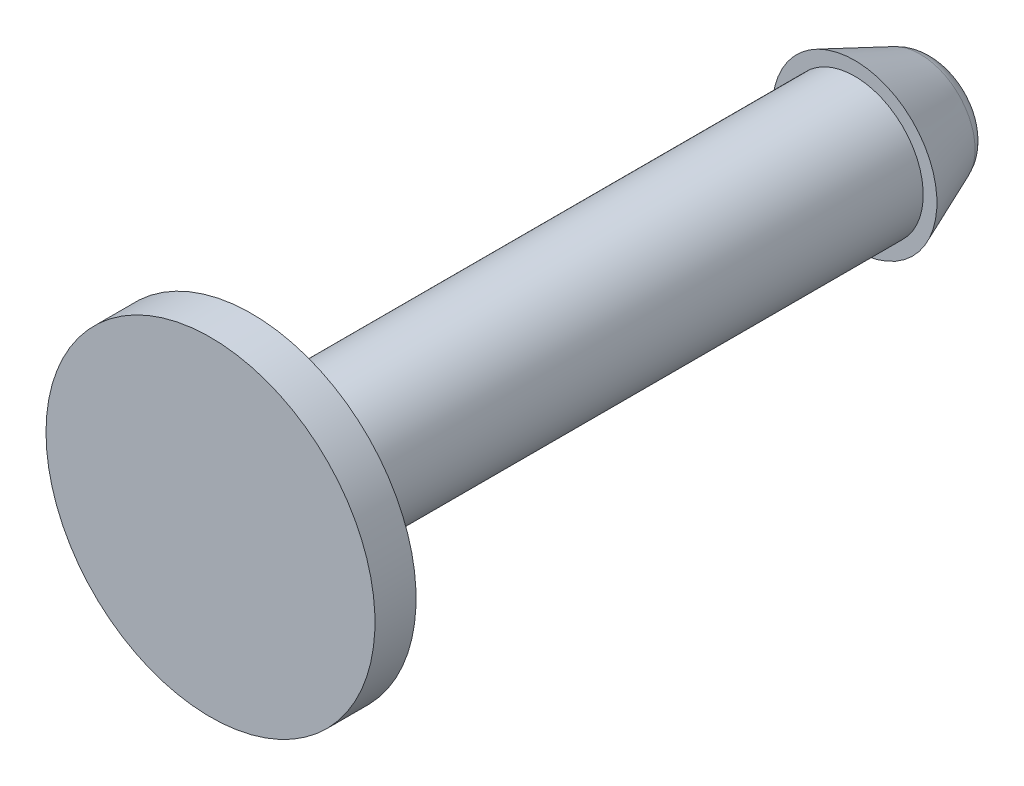
ISO-10303-21;
HEADER;
FILE_DESCRIPTION(('STEP AP214'),'2;1');
FILE_NAME('part.step','',(''),(''),'','','');
FILE_SCHEMA(('AUTOMOTIVE_DESIGN { 1 0 10303 214 1 1 1 1 }'));
ENDSEC;
DATA;
#1=APPLICATION_CONTEXT('core data for automotive mechanical design processes');
#2=APPLICATION_PROTOCOL_DEFINITION('international standard','automotive_design',2000,#1);
#3=PRODUCT_CONTEXT('',#1,'mechanical');
#4=PRODUCT('Part','Part','',(#3));
#5=PRODUCT_RELATED_PRODUCT_CATEGORY('part','',(#4));
#6=PRODUCT_DEFINITION_FORMATION('','',#4);
#7=PRODUCT_DEFINITION_CONTEXT('part definition',#1,'design');
#8=PRODUCT_DEFINITION('design','',#6,#7);
#9=PRODUCT_DEFINITION_SHAPE('','',#8);
#10=(LENGTH_UNIT() NAMED_UNIT(*) SI_UNIT(.MILLI.,.METRE.));
#11=(NAMED_UNIT(*) PLANE_ANGLE_UNIT() SI_UNIT($,.RADIAN.));
#12=(NAMED_UNIT(*) SI_UNIT($,.STERADIAN.) SOLID_ANGLE_UNIT());
#13=UNCERTAINTY_MEASURE_WITH_UNIT(LENGTH_MEASURE(1.E-05),#10,'distance_accuracy_value','');
#14=(GEOMETRIC_REPRESENTATION_CONTEXT(3) GLOBAL_UNCERTAINTY_ASSIGNED_CONTEXT((#13)) GLOBAL_UNIT_ASSIGNED_CONTEXT((#10,
#11,#12)) REPRESENTATION_CONTEXT('',''));
#15=CARTESIAN_POINT('',(0.,0.,0.));
#16=DIRECTION('',(0.,0.,1.));
#17=DIRECTION('',(1.,0.,0.));
#18=AXIS2_PLACEMENT_3D('',#15,#16,#17);
#19=CARTESIAN_POINT('',(0.,0.,-23.5));
#20=DIRECTION('',(0.,0.,-1.));
#21=DIRECTION('',(-1.,0.,0.));
#22=AXIS2_PLACEMENT_3D('',#19,#20,#21);
#23=PLANE('',#22);
#24=CARTESIAN_POINT('',(0.,0.,-23.5));
#25=DIRECTION('',(0.,0.,-1.));
#26=DIRECTION('',(-1.,0.,0.));
#27=AXIS2_PLACEMENT_3D('',#24,#25,#26);
#28=CIRCLE('',#27,3.);
#29=CARTESIAN_POINT('',(-3.,0.,-23.5));
#30=VERTEX_POINT('',#29);
#31=EDGE_CURVE('E61',#30,#30,#28,.T.);
#32=ORIENTED_EDGE('',*,*,#31,.F.);
#33=EDGE_LOOP('',(#32));
#34=FACE_BOUND('',#33,.T.);
#35=CARTESIAN_POINT('',(0.,0.,-23.5));
#36=DIRECTION('',(0.,0.,-1.));
#37=DIRECTION('',(-1.,0.,0.));
#38=AXIS2_PLACEMENT_3D('',#35,#36,#37);
#39=CIRCLE('',#38,2.5);
#40=CARTESIAN_POINT('',(-2.5,0.,-23.5));
#41=VERTEX_POINT('',#40);
#42=EDGE_CURVE('E58',#41,#41,#39,.T.);
#43=ORIENTED_EDGE('',*,*,#42,.T.);
#44=EDGE_LOOP('',(#43));
#45=FACE_BOUND('',#44,.T.);
#46=ADVANCED_FACE('F35',(#34,#45),#23,.F.);
#47=CARTESIAN_POINT('',(0.,0.,-23.5));
#48=DIRECTION('',(0.,0.,1.));
#49=DIRECTION('',(1.,0.,0.));
#50=AXIS2_PLACEMENT_3D('',#47,#48,#49);
#51=CONICAL_SURFACE('',#50,3.,0.394791119699762);
#52=CARTESIAN_POINT('',(0.,0.,-25.8846153846154));
#53=DIRECTION('',(0.,0.,-1.));
#54=DIRECTION('',(-1.,0.,0.));
#55=AXIS2_PLACEMENT_3D('',#52,#53,#54);
#56=CIRCLE('',#55,2.00641025641026);
#57=CARTESIAN_POINT('',(-2.00641025641026,0.,-25.8846153846154));
#58=VERTEX_POINT('',#57);
#59=EDGE_CURVE('E10',#58,#58,#56,.F.);
#60=ORIENTED_EDGE('',*,*,#59,.T.);
#61=EDGE_LOOP('',(#60));
#62=FACE_BOUND('',#61,.T.);
#63=ORIENTED_EDGE('',*,*,#31,.T.);
#64=EDGE_LOOP('',(#63));
#65=FACE_BOUND('',#64,.T.);
#66=ADVANCED_FACE('F65',(#62,#65),#51,.T.);
#67=CARTESIAN_POINT('',(0.,0.,-26.5));
#68=DIRECTION('',(0.,0.,1.));
#69=DIRECTION('',(1.,0.,0.));
#70=AXIS2_PLACEMENT_3D('',#67,#68,#69);
#71=PLANE('',#70);
#72=CARTESIAN_POINT('',(0.,0.,-26.5));
#73=DIRECTION('',(0.,0.,1.));
#74=DIRECTION('',(1.,0.,0.));
#75=AXIS2_PLACEMENT_3D('',#72,#73,#74);
#76=CIRCLE('',#75,1.08333333333334);
#77=CARTESIAN_POINT('',(1.08333333333334,0.,-26.5));
#78=VERTEX_POINT('',#77);
#79=EDGE_CURVE('E42',#78,#78,#76,.F.);
#80=ORIENTED_EDGE('',*,*,#79,.T.);
#81=EDGE_LOOP('',(#80));
#82=FACE_BOUND('',#81,.T.);
#83=ADVANCED_FACE('F70',(#82),#71,.F.);
#84=CARTESIAN_POINT('',(0.,0.,-26.5));
#85=DIRECTION('',(0.,0.,-1.));
#86=DIRECTION('',(-1.,0.,0.));
#87=AXIS2_PLACEMENT_3D('',#84,#85,#86);
#88=CYLINDRICAL_SURFACE('',#87,2.5);
#89=ORIENTED_EDGE('',*,*,#42,.F.);
#90=EDGE_LOOP('',(#89));
#91=FACE_BOUND('',#90,.T.);
#92=CARTESIAN_POINT('',(0.,0.,-1.5));
#93=DIRECTION('',(0.,0.,-1.));
#94=DIRECTION('',(-1.,0.,0.));
#95=AXIS2_PLACEMENT_3D('',#92,#93,#94);
#96=CIRCLE('',#95,2.5);
#97=CARTESIAN_POINT('',(-2.5,0.,-1.5));
#98=VERTEX_POINT('',#97);
#99=EDGE_CURVE('E55',#98,#98,#96,.T.);
#100=ORIENTED_EDGE('',*,*,#99,.T.);
#101=EDGE_LOOP('',(#100));
#102=FACE_BOUND('',#101,.T.);
#103=ADVANCED_FACE('F73',(#91,#102),#88,.T.);
#104=CARTESIAN_POINT('',(0.,0.,-1.5));
#105=DIRECTION('',(0.,0.,1.));
#106=DIRECTION('',(1.,0.,0.));
#107=AXIS2_PLACEMENT_3D('',#104,#105,#106);
#108=PLANE('',#107);
#109=ORIENTED_EDGE('',*,*,#99,.F.);
#110=EDGE_LOOP('',(#109));
#111=FACE_BOUND('',#110,.T.);
#112=CARTESIAN_POINT('',(0.,0.,-1.5));
#113=DIRECTION('',(0.,0.,-1.));
#114=DIRECTION('',(-1.,0.,0.));
#115=AXIS2_PLACEMENT_3D('',#112,#113,#114);
#116=CIRCLE('',#115,6.);
#117=CARTESIAN_POINT('',(-6.,0.,-1.5));
#118=VERTEX_POINT('',#117);
#119=EDGE_CURVE('E50',#118,#118,#116,.T.);
#120=ORIENTED_EDGE('',*,*,#119,.T.);
#121=EDGE_LOOP('',(#120));
#122=FACE_BOUND('',#121,.T.);
#123=ADVANCED_FACE('F76',(#111,#122),#108,.F.);
#124=CARTESIAN_POINT('',(0.,0.,-26.5));
#125=DIRECTION('',(0.,0.,-1.));
#126=DIRECTION('',(-1.,0.,0.));
#127=AXIS2_PLACEMENT_3D('',#124,#125,#126);
#128=CYLINDRICAL_SURFACE('',#127,6.);
#129=ORIENTED_EDGE('',*,*,#119,.F.);
#130=EDGE_LOOP('',(#129));
#131=FACE_BOUND('',#130,.T.);
#132=CARTESIAN_POINT('',(0.,0.,0.));
#133=DIRECTION('',(0.,0.,-1.));
#134=DIRECTION('',(-1.,0.,0.));
#135=AXIS2_PLACEMENT_3D('',#132,#133,#134);
#136=CIRCLE('',#135,6.);
#137=CARTESIAN_POINT('',(-6.,0.,0.));
#138=VERTEX_POINT('',#137);
#139=EDGE_CURVE('E46',#138,#138,#136,.T.);
#140=ORIENTED_EDGE('',*,*,#139,.T.);
#141=EDGE_LOOP('',(#140));
#142=FACE_BOUND('',#141,.T.);
#143=ADVANCED_FACE('F82',(#131,#142),#128,.T.);
#144=CARTESIAN_POINT('',(0.,0.,0.));
#145=DIRECTION('',(0.,0.,-1.));
#146=DIRECTION('',(-1.,0.,0.));
#147=AXIS2_PLACEMENT_3D('',#144,#145,#146);
#148=PLANE('',#147);
#149=ORIENTED_EDGE('',*,*,#139,.F.);
#150=EDGE_LOOP('',(#149));
#151=FACE_BOUND('',#150,.T.);
#152=ADVANCED_FACE('F88',(#151),#148,.F.);
#153=CARTESIAN_POINT('',(0.,0.,-25.5));
#154=DIRECTION('',(0.,0.,1.));
#155=DIRECTION('',(1.,0.,0.));
#156=AXIS2_PLACEMENT_3D('',#153,#154,#155);
#157=TOROIDAL_SURFACE('',#156,1.08333333333334,1.);
#158=ORIENTED_EDGE('',*,*,#59,.F.);
#159=EDGE_LOOP('',(#158));
#160=FACE_BOUND('',#159,.T.);
#161=ORIENTED_EDGE('',*,*,#79,.F.);
#162=EDGE_LOOP('',(#161));
#163=FACE_BOUND('',#162,.T.);
#164=ADVANCED_FACE('F37',(#160,#163),#157,.T.);
#165=CLOSED_SHELL('',(#46,#66,#83,#103,#123,#143,#152,#164));
#166=MANIFOLD_SOLID_BREP('B2',#165);
#167=ADVANCED_BREP_SHAPE_REPRESENTATION('',(#18,#166),#14);
#168=SHAPE_DEFINITION_REPRESENTATION(#9,#167);
ENDSEC;
END-ISO-10303-21;
